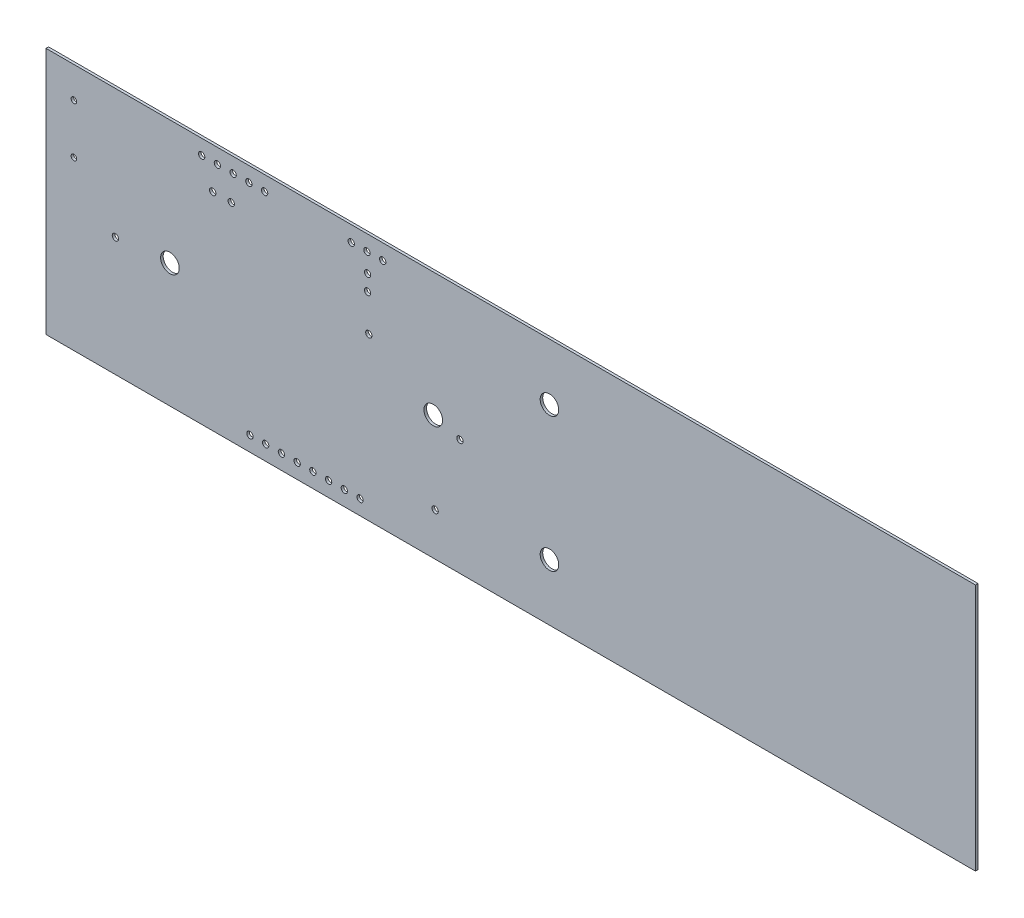
ISO-10303-21;
HEADER;
FILE_DESCRIPTION(('STEP AP214'),'2;1');
FILE_NAME('part.step','',(''),(''),'','','');
FILE_SCHEMA(('AUTOMOTIVE_DESIGN { 1 0 10303 214 1 1 1 1 }'));
ENDSEC;
DATA;
#1=APPLICATION_CONTEXT('core data for automotive mechanical design processes');
#2=APPLICATION_PROTOCOL_DEFINITION('international standard','automotive_design',2000,#1);
#3=PRODUCT_CONTEXT('',#1,'mechanical');
#4=PRODUCT('Part','Part','',(#3));
#5=PRODUCT_RELATED_PRODUCT_CATEGORY('part','',(#4));
#6=PRODUCT_DEFINITION_FORMATION('','',#4);
#7=PRODUCT_DEFINITION_CONTEXT('part definition',#1,'design');
#8=PRODUCT_DEFINITION('design','',#6,#7);
#9=PRODUCT_DEFINITION_SHAPE('','',#8);
#10=(LENGTH_UNIT() NAMED_UNIT(*) SI_UNIT(.MILLI.,.METRE.));
#11=(NAMED_UNIT(*) PLANE_ANGLE_UNIT() SI_UNIT($,.RADIAN.));
#12=(NAMED_UNIT(*) SI_UNIT($,.STERADIAN.) SOLID_ANGLE_UNIT());
#13=UNCERTAINTY_MEASURE_WITH_UNIT(LENGTH_MEASURE(1.E-05),#10,'distance_accuracy_value','');
#14=(GEOMETRIC_REPRESENTATION_CONTEXT(3) GLOBAL_UNCERTAINTY_ASSIGNED_CONTEXT((#13)) GLOBAL_UNIT_ASSIGNED_CONTEXT((#10,
#11,#12)) REPRESENTATION_CONTEXT('',''));
#15=CARTESIAN_POINT('',(0.,0.,0.));
#16=DIRECTION('',(0.,0.,1.));
#17=DIRECTION('',(1.,0.,0.));
#18=AXIS2_PLACEMENT_3D('',#15,#16,#17);
#19=CARTESIAN_POINT('',(149.99999972,0.,0.));
#20=DIRECTION('',(0.,0.,-1.));
#21=DIRECTION('',(-1.,0.,0.));
#22=AXIS2_PLACEMENT_3D('',#19,#20,#21);
#23=PLANE('',#22);
#24=CARTESIAN_POINT('',(81.25000006,30.8299993,0.));
#25=DIRECTION('',(0.,0.,-1.));
#26=DIRECTION('',(-1.,0.,0.));
#27=AXIS2_PLACEMENT_3D('',#24,#25,#26);
#28=CIRCLE('',#27,1.49999954);
#29=CARTESIAN_POINT('',(79.75000052,30.8299993,0.));
#30=VERTEX_POINT('',#29);
#31=EDGE_CURVE('E167',#30,#30,#28,.F.);
#32=ORIENTED_EDGE('',*,*,#31,.T.);
#33=EDGE_LOOP('',(#32));
#34=FACE_BOUND('',#33,.T.);
#35=CARTESIAN_POINT('',(54.339998,37.49999866,0.));
#36=DIRECTION('',(0.,0.,-1.));
#37=DIRECTION('',(-1.,0.,0.));
#38=AXIS2_PLACEMENT_3D('',#35,#36,#37);
#39=CIRCLE('',#38,0.50999898);
#40=CARTESIAN_POINT('',(53.82999902,37.49999866,0.));
#41=VERTEX_POINT('',#40);
#42=EDGE_CURVE('E170',#41,#41,#39,.F.);
#43=ORIENTED_EDGE('',*,*,#42,.T.);
#44=EDGE_LOOP('',(#43));
#45=FACE_BOUND('',#44,.T.);
#46=CARTESIAN_POINT('',(62.49999946,20.00000064,0.));
#47=DIRECTION('',(0.,0.,-1.));
#48=DIRECTION('',(-1.,0.,0.));
#49=AXIS2_PLACEMENT_3D('',#46,#47,#48);
#50=CIRCLE('',#49,1.49999954);
#51=CARTESIAN_POINT('',(60.99999992,20.00000064,0.));
#52=VERTEX_POINT('',#51);
#53=EDGE_CURVE('E173',#52,#52,#50,.F.);
#54=ORIENTED_EDGE('',*,*,#53,.T.);
#55=EDGE_LOOP('',(#54));
#56=FACE_BOUND('',#55,.T.);
#57=CARTESIAN_POINT('',(52.09999994,26.10000114,0.));
#58=DIRECTION('',(0.,0.,-1.));
#59=DIRECTION('',(-1.,0.,0.));
#60=AXIS2_PLACEMENT_3D('',#57,#58,#59);
#61=CIRCLE('',#60,0.50999898);
#62=CARTESIAN_POINT('',(51.59000096,26.10000114,0.));
#63=VERTEX_POINT('',#62);
#64=EDGE_CURVE('E176',#63,#63,#61,.F.);
#65=ORIENTED_EDGE('',*,*,#64,.T.);
#66=EDGE_LOOP('',(#65));
#67=FACE_BOUND('',#66,.T.);
#68=CARTESIAN_POINT('',(51.799998,37.49999866,0.));
#69=DIRECTION('',(0.,0.,-1.));
#70=DIRECTION('',(-1.,0.,0.));
#71=AXIS2_PLACEMENT_3D('',#68,#69,#70);
#72=CIRCLE('',#71,0.50999898);
#73=CARTESIAN_POINT('',(51.28999902,37.49999866,0.));
#74=VERTEX_POINT('',#73);
#75=EDGE_CURVE('E179',#74,#74,#72,.F.);
#76=ORIENTED_EDGE('',*,*,#75,.T.);
#77=EDGE_LOOP('',(#76));
#78=FACE_BOUND('',#77,.T.);
#79=CARTESIAN_POINT('',(49.259998,37.49999866,0.));
#80=DIRECTION('',(0.,0.,-1.));
#81=DIRECTION('',(-1.,0.,0.));
#82=AXIS2_PLACEMENT_3D('',#79,#80,#81);
#83=CIRCLE('',#82,0.50999898);
#84=CARTESIAN_POINT('',(48.74999902,37.49999866,0.));
#85=VERTEX_POINT('',#84);
#86=EDGE_CURVE('E182',#85,#85,#83,.F.);
#87=ORIENTED_EDGE('',*,*,#86,.T.);
#88=EDGE_LOOP('',(#87));
#89=FACE_BOUND('',#88,.T.);
#90=CARTESIAN_POINT('',(51.8999978,31.92999964,0.));
#91=DIRECTION('',(0.,0.,-1.));
#92=DIRECTION('',(-1.,0.,0.));
#93=AXIS2_PLACEMENT_3D('',#90,#91,#92);
#94=CIRCLE('',#93,0.50999898);
#95=CARTESIAN_POINT('',(51.38999882,31.92999964,0.));
#96=VERTEX_POINT('',#95);
#97=EDGE_CURVE('E185',#96,#96,#94,.F.);
#98=ORIENTED_EDGE('',*,*,#97,.T.);
#99=EDGE_LOOP('',(#98));
#100=FACE_BOUND('',#99,.T.);
#101=CARTESIAN_POINT('',(51.8999978,34.46999964,0.));
#102=DIRECTION('',(0.,0.,-1.));
#103=DIRECTION('',(-1.,0.,0.));
#104=AXIS2_PLACEMENT_3D('',#101,#102,#103);
#105=CIRCLE('',#104,0.50999898);
#106=CARTESIAN_POINT('',(51.38999882,34.46999964,0.));
#107=VERTEX_POINT('',#106);
#108=EDGE_CURVE('E188',#107,#107,#105,.F.);
#109=ORIENTED_EDGE('',*,*,#108,.T.);
#110=EDGE_LOOP('',(#109));
#111=FACE_BOUND('',#110,.T.);
#112=CARTESIAN_POINT('',(81.25000006,9.16999944,0.));
#113=DIRECTION('',(0.,0.,-1.));
#114=DIRECTION('',(-1.,0.,0.));
#115=AXIS2_PLACEMENT_3D('',#112,#113,#114);
#116=CIRCLE('',#115,1.49999954);
#117=CARTESIAN_POINT('',(79.75000052,9.16999944,0.));
#118=VERTEX_POINT('',#117);
#119=EDGE_CURVE('E191',#118,#118,#116,.F.);
#120=ORIENTED_EDGE('',*,*,#119,.T.);
#121=EDGE_LOOP('',(#120));
#122=FACE_BOUND('',#121,.T.);
#123=CARTESIAN_POINT('',(66.80000102,18.7000007,0.));
#124=DIRECTION('',(0.,0.,-1.));
#125=DIRECTION('',(-1.,0.,0.));
#126=AXIS2_PLACEMENT_3D('',#123,#124,#125);
#127=CIRCLE('',#126,0.50999898);
#128=CARTESIAN_POINT('',(66.29000204,18.7000007,0.));
#129=VERTEX_POINT('',#128);
#130=EDGE_CURVE('E194',#129,#129,#127,.F.);
#131=ORIENTED_EDGE('',*,*,#130,.T.);
#132=EDGE_LOOP('',(#131));
#133=FACE_BOUND('',#132,.T.);
#134=CARTESIAN_POINT('',(62.79999886,6.8999989,0.));
#135=DIRECTION('',(0.,0.,-1.));
#136=DIRECTION('',(-1.,0.,0.));
#137=AXIS2_PLACEMENT_3D('',#134,#135,#136);
#138=CIRCLE('',#137,0.50999898);
#139=CARTESIAN_POINT('',(62.28999988,6.8999989,0.));
#140=VERTEX_POINT('',#139);
#141=EDGE_CURVE('E197',#140,#140,#138,.F.);
#142=ORIENTED_EDGE('',*,*,#141,.T.);
#143=EDGE_LOOP('',(#142));
#144=FACE_BOUND('',#143,.T.);
#145=CARTESIAN_POINT('',(50.69000022,2.40000028,0.));
#146=DIRECTION('',(0.,0.,-1.));
#147=DIRECTION('',(-1.,0.,0.));
#148=AXIS2_PLACEMENT_3D('',#145,#146,#147);
#149=CIRCLE('',#148,0.50999898);
#150=CARTESIAN_POINT('',(50.18000124,2.40000028,0.));
#151=VERTEX_POINT('',#150);
#152=EDGE_CURVE('E200',#151,#151,#149,.F.);
#153=ORIENTED_EDGE('',*,*,#152,.T.);
#154=EDGE_LOOP('',(#153));
#155=FACE_BOUND('',#154,.T.);
#156=CARTESIAN_POINT('',(45.61000022,2.40000028,0.));
#157=DIRECTION('',(0.,0.,-1.));
#158=DIRECTION('',(-1.,0.,0.));
#159=AXIS2_PLACEMENT_3D('',#156,#157,#158);
#160=CIRCLE('',#159,0.50999898);
#161=CARTESIAN_POINT('',(45.10000124,2.40000028,0.));
#162=VERTEX_POINT('',#161);
#163=EDGE_CURVE('E203',#162,#162,#160,.F.);
#164=ORIENTED_EDGE('',*,*,#163,.T.);
#165=EDGE_LOOP('',(#164));
#166=FACE_BOUND('',#165,.T.);
#167=CARTESIAN_POINT('',(43.07000022,2.40000028,0.));
#168=DIRECTION('',(0.,0.,-1.));
#169=DIRECTION('',(-1.,0.,0.));
#170=AXIS2_PLACEMENT_3D('',#167,#168,#169);
#171=CIRCLE('',#170,0.50999898);
#172=CARTESIAN_POINT('',(42.56000124,2.40000028,0.));
#173=VERTEX_POINT('',#172);
#174=EDGE_CURVE('E206',#173,#173,#171,.F.);
#175=ORIENTED_EDGE('',*,*,#174,.T.);
#176=EDGE_LOOP('',(#175));
#177=FACE_BOUND('',#176,.T.);
#178=CARTESIAN_POINT('',(48.15000022,2.40000028,0.));
#179=DIRECTION('',(0.,0.,-1.));
#180=DIRECTION('',(-1.,0.,0.));
#181=AXIS2_PLACEMENT_3D('',#178,#179,#180);
#182=CIRCLE('',#181,0.50999898);
#183=CARTESIAN_POINT('',(47.64000124,2.40000028,0.));
#184=VERTEX_POINT('',#183);
#185=EDGE_CURVE('E209',#184,#184,#182,.F.);
#186=ORIENTED_EDGE('',*,*,#185,.T.);
#187=EDGE_LOOP('',(#186));
#188=FACE_BOUND('',#187,.T.);
#189=CARTESIAN_POINT('',(35.28000056,37.600001,0.));
#190=DIRECTION('',(0.,0.,-1.));
#191=DIRECTION('',(-1.,0.,0.));
#192=AXIS2_PLACEMENT_3D('',#189,#190,#191);
#193=CIRCLE('',#192,0.50999898);
#194=CARTESIAN_POINT('',(34.77000158,37.600001,0.));
#195=VERTEX_POINT('',#194);
#196=EDGE_CURVE('E212',#195,#195,#193,.F.);
#197=ORIENTED_EDGE('',*,*,#196,.T.);
#198=EDGE_LOOP('',(#197));
#199=FACE_BOUND('',#198,.T.);
#200=CARTESIAN_POINT('',(32.74000056,37.600001,0.));
#201=DIRECTION('',(0.,0.,-1.));
#202=DIRECTION('',(-1.,0.,0.));
#203=AXIS2_PLACEMENT_3D('',#200,#201,#202);
#204=CIRCLE('',#203,0.50999898);
#205=CARTESIAN_POINT('',(32.23000158,37.600001,0.));
#206=VERTEX_POINT('',#205);
#207=EDGE_CURVE('E215',#206,#206,#204,.F.);
#208=ORIENTED_EDGE('',*,*,#207,.T.);
#209=EDGE_LOOP('',(#208));
#210=FACE_BOUND('',#209,.T.);
#211=CARTESIAN_POINT('',(30.20000056,37.600001,0.));
#212=DIRECTION('',(0.,0.,-1.));
#213=DIRECTION('',(-1.,0.,0.));
#214=AXIS2_PLACEMENT_3D('',#211,#212,#213);
#215=CIRCLE('',#214,0.50999898);
#216=CARTESIAN_POINT('',(29.69000158,37.600001,0.));
#217=VERTEX_POINT('',#216);
#218=EDGE_CURVE('E218',#217,#217,#215,.F.);
#219=ORIENTED_EDGE('',*,*,#218,.T.);
#220=EDGE_LOOP('',(#219));
#221=FACE_BOUND('',#220,.T.);
#222=CARTESIAN_POINT('',(29.90000116,33.39999924,0.));
#223=DIRECTION('',(0.,0.,-1.));
#224=DIRECTION('',(-1.,0.,0.));
#225=AXIS2_PLACEMENT_3D('',#222,#223,#224);
#226=CIRCLE('',#225,0.50999898);
#227=CARTESIAN_POINT('',(29.39000218,33.39999924,0.));
#228=VERTEX_POINT('',#227);
#229=EDGE_CURVE('E221',#228,#228,#226,.F.);
#230=ORIENTED_EDGE('',*,*,#229,.T.);
#231=EDGE_LOOP('',(#230));
#232=FACE_BOUND('',#231,.T.);
#233=CARTESIAN_POINT('',(27.66000056,37.600001,0.));
#234=DIRECTION('',(0.,0.,-1.));
#235=DIRECTION('',(-1.,0.,0.));
#236=AXIS2_PLACEMENT_3D('',#233,#234,#235);
#237=CIRCLE('',#236,0.50999898);
#238=CARTESIAN_POINT('',(27.15000158,37.600001,0.));
#239=VERTEX_POINT('',#238);
#240=EDGE_CURVE('E224',#239,#239,#237,.F.);
#241=ORIENTED_EDGE('',*,*,#240,.T.);
#242=EDGE_LOOP('',(#241));
#243=FACE_BOUND('',#242,.T.);
#244=CARTESIAN_POINT('',(25.12000056,37.600001,0.));
#245=DIRECTION('',(0.,0.,-1.));
#246=DIRECTION('',(-1.,0.,0.));
#247=AXIS2_PLACEMENT_3D('',#244,#245,#246);
#248=CIRCLE('',#247,0.50999898);
#249=CARTESIAN_POINT('',(24.61000158,37.600001,0.));
#250=VERTEX_POINT('',#249);
#251=EDGE_CURVE('E227',#250,#250,#248,.F.);
#252=ORIENTED_EDGE('',*,*,#251,.T.);
#253=EDGE_LOOP('',(#252));
#254=FACE_BOUND('',#253,.T.);
#255=CARTESIAN_POINT('',(26.89999954,33.39999924,0.));
#256=DIRECTION('',(0.,0.,-1.));
#257=DIRECTION('',(-1.,0.,0.));
#258=AXIS2_PLACEMENT_3D('',#255,#256,#257);
#259=CIRCLE('',#258,0.50999898);
#260=CARTESIAN_POINT('',(26.39000056,33.39999924,0.));
#261=VERTEX_POINT('',#260);
#262=EDGE_CURVE('E230',#261,#261,#259,.F.);
#263=ORIENTED_EDGE('',*,*,#262,.T.);
#264=EDGE_LOOP('',(#263));
#265=FACE_BOUND('',#264,.T.);
#266=CARTESIAN_POINT('',(4.5000037,35.00000112,0.));
#267=DIRECTION('',(0.,0.,-1.));
#268=DIRECTION('',(-1.,0.,0.));
#269=AXIS2_PLACEMENT_3D('',#266,#267,#268);
#270=CIRCLE('',#269,0.4499991);
#271=CARTESIAN_POINT('',(4.0500046,35.00000112,0.));
#272=VERTEX_POINT('',#271);
#273=EDGE_CURVE('E233',#272,#272,#270,.F.);
#274=ORIENTED_EDGE('',*,*,#273,.T.);
#275=EDGE_LOOP('',(#274));
#276=FACE_BOUND('',#275,.T.);
#277=CARTESIAN_POINT('',(35.45000022,2.40000028,0.));
#278=DIRECTION('',(0.,0.,-1.));
#279=DIRECTION('',(-1.,0.,0.));
#280=AXIS2_PLACEMENT_3D('',#277,#278,#279);
#281=CIRCLE('',#280,0.50999898);
#282=CARTESIAN_POINT('',(34.94000124,2.40000028,0.));
#283=VERTEX_POINT('',#282);
#284=EDGE_CURVE('E236',#283,#283,#281,.F.);
#285=ORIENTED_EDGE('',*,*,#284,.T.);
#286=EDGE_LOOP('',(#285));
#287=FACE_BOUND('',#286,.T.);
#288=CARTESIAN_POINT('',(32.91000022,2.40000028,0.));
#289=DIRECTION('',(0.,0.,-1.));
#290=DIRECTION('',(-1.,0.,0.));
#291=AXIS2_PLACEMENT_3D('',#288,#289,#290);
#292=CIRCLE('',#291,0.50999898);
#293=CARTESIAN_POINT('',(32.40000124,2.40000028,0.));
#294=VERTEX_POINT('',#293);
#295=EDGE_CURVE('E239',#294,#294,#292,.F.);
#296=ORIENTED_EDGE('',*,*,#295,.T.);
#297=EDGE_LOOP('',(#296));
#298=FACE_BOUND('',#297,.T.);
#299=CARTESIAN_POINT('',(40.53000022,2.40000028,0.));
#300=DIRECTION('',(0.,0.,-1.));
#301=DIRECTION('',(-1.,0.,0.));
#302=AXIS2_PLACEMENT_3D('',#299,#300,#301);
#303=CIRCLE('',#302,0.50999898);
#304=CARTESIAN_POINT('',(40.02000124,2.40000028,0.));
#305=VERTEX_POINT('',#304);
#306=EDGE_CURVE('E242',#305,#305,#303,.F.);
#307=ORIENTED_EDGE('',*,*,#306,.T.);
#308=EDGE_LOOP('',(#307));
#309=FACE_BOUND('',#308,.T.);
#310=CARTESIAN_POINT('',(37.99000022,2.40000028,0.));
#311=DIRECTION('',(0.,0.,-1.));
#312=DIRECTION('',(-1.,0.,0.));
#313=AXIS2_PLACEMENT_3D('',#310,#311,#312);
#314=CIRCLE('',#313,0.50999898);
#315=CARTESIAN_POINT('',(37.48000124,2.40000028,0.));
#316=VERTEX_POINT('',#315);
#317=EDGE_CURVE('E245',#316,#316,#314,.F.);
#318=ORIENTED_EDGE('',*,*,#317,.T.);
#319=EDGE_LOOP('',(#318));
#320=FACE_BOUND('',#319,.T.);
#321=CARTESIAN_POINT('',(20.00000064,20.00000064,0.));
#322=DIRECTION('',(0.,0.,-1.));
#323=DIRECTION('',(-1.,0.,0.));
#324=AXIS2_PLACEMENT_3D('',#321,#322,#323);
#325=CIRCLE('',#324,1.49999954);
#326=CARTESIAN_POINT('',(18.5000011,20.00000064,0.));
#327=VERTEX_POINT('',#326);
#328=EDGE_CURVE('E248',#327,#327,#325,.F.);
#329=ORIENTED_EDGE('',*,*,#328,.T.);
#330=EDGE_LOOP('',(#329));
#331=FACE_BOUND('',#330,.T.);
#332=CARTESIAN_POINT('',(4.5000037,26.99999934,0.));
#333=DIRECTION('',(0.,0.,-1.));
#334=DIRECTION('',(-1.,0.,0.));
#335=AXIS2_PLACEMENT_3D('',#332,#333,#334);
#336=CIRCLE('',#335,0.4499991);
#337=CARTESIAN_POINT('',(4.0500046,26.99999934,0.));
#338=VERTEX_POINT('',#337);
#339=EDGE_CURVE('E250',#338,#338,#336,.F.);
#340=ORIENTED_EDGE('',*,*,#339,.T.);
#341=EDGE_LOOP('',(#340));
#342=FACE_BOUND('',#341,.T.);
#343=CARTESIAN_POINT('',(11.20000046,19.1999997,0.));
#344=DIRECTION('',(0.,0.,-1.));
#345=DIRECTION('',(-1.,0.,0.));
#346=AXIS2_PLACEMENT_3D('',#343,#344,#345);
#347=CIRCLE('',#346,0.50999898);
#348=CARTESIAN_POINT('',(10.69000148,19.1999997,0.));
#349=VERTEX_POINT('',#348);
#350=EDGE_CURVE('E20',#349,#349,#347,.F.);
#351=ORIENTED_EDGE('',*,*,#350,.T.);
#352=EDGE_LOOP('',(#351));
#353=FACE_BOUND('',#352,.T.);
#354=DIRECTION('',(1.,0.,0.));
#355=VECTOR('',#354,1.);
#356=CARTESIAN_POINT('',(149.99999972,39.99999874,0.));
#357=LINE('',#356,#355);
#358=CARTESIAN_POINT('',(0.,39.99999874,0.));
#359=VERTEX_POINT('',#358);
#360=CARTESIAN_POINT('',(149.99999972,39.99999874,0.));
#361=VERTEX_POINT('',#360);
#362=EDGE_CURVE('E264',#359,#361,#357,.T.);
#363=ORIENTED_EDGE('',*,*,#362,.T.);
#364=DIRECTION('',(0.,1.,0.));
#365=VECTOR('',#364,1.);
#366=CARTESIAN_POINT('',(149.99999972,0.,0.));
#367=LINE('',#366,#365);
#368=CARTESIAN_POINT('',(149.99999972,0.,0.));
#369=VERTEX_POINT('',#368);
#370=EDGE_CURVE('E60',#361,#369,#367,.F.);
#371=ORIENTED_EDGE('',*,*,#370,.T.);
#372=DIRECTION('',(1.,0.,0.));
#373=VECTOR('',#372,1.);
#374=CARTESIAN_POINT('',(0.,0.,0.));
#375=LINE('',#374,#373);
#376=CARTESIAN_POINT('',(0.,0.,0.));
#377=VERTEX_POINT('',#376);
#378=EDGE_CURVE('E59',#369,#377,#375,.F.);
#379=ORIENTED_EDGE('',*,*,#378,.T.);
#380=DIRECTION('',(0.,1.,0.));
#381=VECTOR('',#380,1.);
#382=CARTESIAN_POINT('',(0.,39.99999874,0.));
#383=LINE('',#382,#381);
#384=EDGE_CURVE('E56',#377,#359,#383,.T.);
#385=ORIENTED_EDGE('',*,*,#384,.T.);
#386=EDGE_LOOP('',(#363,#371,#379,#385));
#387=FACE_BOUND('',#386,.T.);
#388=ADVANCED_FACE('F17',(#34,#45,#56,#67,#78,#89,#100,#111,#122,#133,#144,#155,#166,#177,#188,
#199,#210,#221,#232,#243,#254,#265,#276,#287,#298,#309,#320,#331,#342,#353,#387),#23,.T.);
#389=CARTESIAN_POINT('',(0.,0.,0.));
#390=DIRECTION('',(0.,1.,0.));
#391=DIRECTION('',(0.,0.,1.));
#392=AXIS2_PLACEMENT_3D('',#389,#390,#391);
#393=PLANE('',#392);
#394=DIRECTION('',(0.,0.,1.));
#395=VECTOR('',#394,1.);
#396=CARTESIAN_POINT('',(149.99999972,0.,0.));
#397=LINE('',#396,#395);
#398=CARTESIAN_POINT('',(149.99999972,0.,0.41148));
#399=VERTEX_POINT('',#398);
#400=EDGE_CURVE('E258',#369,#399,#397,.T.);
#401=ORIENTED_EDGE('',*,*,#400,.T.);
#402=DIRECTION('',(-1.,0.,0.));
#403=VECTOR('',#402,1.);
#404=CARTESIAN_POINT('',(149.99999972,0.,0.41148));
#405=LINE('',#404,#403);
#406=CARTESIAN_POINT('',(0.,0.,0.41148));
#407=VERTEX_POINT('',#406);
#408=EDGE_CURVE('E76',#399,#407,#405,.T.);
#409=ORIENTED_EDGE('',*,*,#408,.T.);
#410=DIRECTION('',(0.,0.,-1.));
#411=VECTOR('',#410,1.);
#412=CARTESIAN_POINT('',(0.,0.,0.));
#413=LINE('',#412,#411);
#414=EDGE_CURVE('E65',#407,#377,#413,.T.);
#415=ORIENTED_EDGE('',*,*,#414,.T.);
#416=ORIENTED_EDGE('',*,*,#378,.F.);
#417=EDGE_LOOP('',(#401,#409,#415,#416));
#418=FACE_BOUND('',#417,.T.);
#419=ADVANCED_FACE('F75',(#418),#393,.F.);
#420=CARTESIAN_POINT('',(0.,39.99999874,0.));
#421=DIRECTION('',(1.,0.,0.));
#422=DIRECTION('',(0.,0.,-1.));
#423=AXIS2_PLACEMENT_3D('',#420,#421,#422);
#424=PLANE('',#423);
#425=ORIENTED_EDGE('',*,*,#414,.F.);
#426=DIRECTION('',(0.,1.,0.));
#427=VECTOR('',#426,1.);
#428=CARTESIAN_POINT('',(0.,0.,0.41148));
#429=LINE('',#428,#427);
#430=CARTESIAN_POINT('',(0.,39.99999874,0.41148));
#431=VERTEX_POINT('',#430);
#432=EDGE_CURVE('E272',#407,#431,#429,.T.);
#433=ORIENTED_EDGE('',*,*,#432,.T.);
#434=DIRECTION('',(0.,0.,-1.));
#435=VECTOR('',#434,1.);
#436=CARTESIAN_POINT('',(0.,39.99999874,0.));
#437=LINE('',#436,#435);
#438=EDGE_CURVE('E72',#431,#359,#437,.T.);
#439=ORIENTED_EDGE('',*,*,#438,.T.);
#440=ORIENTED_EDGE('',*,*,#384,.F.);
#441=EDGE_LOOP('',(#425,#433,#439,#440));
#442=FACE_BOUND('',#441,.T.);
#443=ADVANCED_FACE('F69',(#442),#424,.F.);
#444=CARTESIAN_POINT('',(149.99999972,39.99999874,0.));
#445=DIRECTION('',(0.,-1.,0.));
#446=DIRECTION('',(0.,0.,-1.));
#447=AXIS2_PLACEMENT_3D('',#444,#445,#446);
#448=PLANE('',#447);
#449=ORIENTED_EDGE('',*,*,#438,.F.);
#450=DIRECTION('',(-1.,0.,0.));
#451=VECTOR('',#450,1.);
#452=CARTESIAN_POINT('',(149.99999972,39.99999874,0.41148));
#453=LINE('',#452,#451);
#454=CARTESIAN_POINT('',(149.99999972,39.99999874,0.41148));
#455=VERTEX_POINT('',#454);
#456=EDGE_CURVE('E270',#431,#455,#453,.F.);
#457=ORIENTED_EDGE('',*,*,#456,.T.);
#458=DIRECTION('',(0.,0.,1.));
#459=VECTOR('',#458,1.);
#460=CARTESIAN_POINT('',(149.99999972,39.99999874,0.));
#461=LINE('',#460,#459);
#462=EDGE_CURVE('E35',#455,#361,#461,.F.);
#463=ORIENTED_EDGE('',*,*,#462,.T.);
#464=ORIENTED_EDGE('',*,*,#362,.F.);
#465=EDGE_LOOP('',(#449,#457,#463,#464));
#466=FACE_BOUND('',#465,.T.);
#467=ADVANCED_FACE('F268',(#466),#448,.F.);
#468=CARTESIAN_POINT('',(149.99999972,0.,0.));
#469=DIRECTION('',(-1.,0.,0.));
#470=DIRECTION('',(0.,0.,1.));
#471=AXIS2_PLACEMENT_3D('',#468,#469,#470);
#472=PLANE('',#471);
#473=ORIENTED_EDGE('',*,*,#462,.F.);
#474=DIRECTION('',(0.,1.,0.));
#475=VECTOR('',#474,1.);
#476=CARTESIAN_POINT('',(149.99999972,0.,0.41148));
#477=LINE('',#476,#475);
#478=EDGE_CURVE('E166',#455,#399,#477,.F.);
#479=ORIENTED_EDGE('',*,*,#478,.T.);
#480=ORIENTED_EDGE('',*,*,#400,.F.);
#481=ORIENTED_EDGE('',*,*,#370,.F.);
#482=EDGE_LOOP('',(#473,#479,#480,#481));
#483=FACE_BOUND('',#482,.T.);
#484=ADVANCED_FACE('F266',(#483),#472,.F.);
#485=CARTESIAN_POINT('',(11.20000046,19.1999997,0.));
#486=DIRECTION('',(0.,0.,-1.));
#487=DIRECTION('',(-1.,0.,0.));
#488=AXIS2_PLACEMENT_3D('',#485,#486,#487);
#489=CYLINDRICAL_SURFACE('',#488,0.50999898);
#490=CARTESIAN_POINT('',(11.20000046,19.1999997,0.41148));
#491=DIRECTION('',(0.,0.,-1.));
#492=DIRECTION('',(-1.,0.,0.));
#493=AXIS2_PLACEMENT_3D('',#490,#491,#492);
#494=CIRCLE('',#493,0.50999898);
#495=CARTESIAN_POINT('',(10.69000148,19.1999997,0.41148));
#496=VERTEX_POINT('',#495);
#497=EDGE_CURVE('E163',#496,#496,#494,.F.);
#498=ORIENTED_EDGE('',*,*,#497,.T.);
#499=EDGE_LOOP('',(#498));
#500=FACE_BOUND('',#499,.T.);
#501=ORIENTED_EDGE('',*,*,#350,.F.);
#502=EDGE_LOOP('',(#501));
#503=FACE_BOUND('',#502,.T.);
#504=ADVANCED_FACE('F400',(#500,#503),#489,.F.);
#505=CARTESIAN_POINT('',(4.5000037,26.99999934,0.));
#506=DIRECTION('',(0.,0.,-1.));
#507=DIRECTION('',(-1.,0.,0.));
#508=AXIS2_PLACEMENT_3D('',#505,#506,#507);
#509=CYLINDRICAL_SURFACE('',#508,0.4499991);
#510=CARTESIAN_POINT('',(4.5000037,26.99999934,0.41148));
#511=DIRECTION('',(0.,0.,-1.));
#512=DIRECTION('',(-1.,0.,0.));
#513=AXIS2_PLACEMENT_3D('',#510,#511,#512);
#514=CIRCLE('',#513,0.4499991);
#515=CARTESIAN_POINT('',(4.0500046,26.99999934,0.41148));
#516=VERTEX_POINT('',#515);
#517=EDGE_CURVE('E160',#516,#516,#514,.F.);
#518=ORIENTED_EDGE('',*,*,#517,.T.);
#519=EDGE_LOOP('',(#518));
#520=FACE_BOUND('',#519,.T.);
#521=ORIENTED_EDGE('',*,*,#339,.F.);
#522=EDGE_LOOP('',(#521));
#523=FACE_BOUND('',#522,.T.);
#524=ADVANCED_FACE('F396',(#520,#523),#509,.F.);
#525=CARTESIAN_POINT('',(20.00000064,20.00000064,0.));
#526=DIRECTION('',(0.,0.,-1.));
#527=DIRECTION('',(-1.,0.,0.));
#528=AXIS2_PLACEMENT_3D('',#525,#526,#527);
#529=CYLINDRICAL_SURFACE('',#528,1.49999954);
#530=CARTESIAN_POINT('',(20.00000064,20.00000064,0.41148));
#531=DIRECTION('',(0.,0.,-1.));
#532=DIRECTION('',(-1.,0.,0.));
#533=AXIS2_PLACEMENT_3D('',#530,#531,#532);
#534=CIRCLE('',#533,1.49999954);
#535=CARTESIAN_POINT('',(18.5000011,20.00000064,0.41148));
#536=VERTEX_POINT('',#535);
#537=EDGE_CURVE('E157',#536,#536,#534,.F.);
#538=ORIENTED_EDGE('',*,*,#537,.T.);
#539=EDGE_LOOP('',(#538));
#540=FACE_BOUND('',#539,.T.);
#541=ORIENTED_EDGE('',*,*,#328,.F.);
#542=EDGE_LOOP('',(#541));
#543=FACE_BOUND('',#542,.T.);
#544=ADVANCED_FACE('F392',(#540,#543),#529,.F.);
#545=CARTESIAN_POINT('',(37.99000022,2.40000028,0.));
#546=DIRECTION('',(0.,0.,-1.));
#547=DIRECTION('',(-1.,0.,0.));
#548=AXIS2_PLACEMENT_3D('',#545,#546,#547);
#549=CYLINDRICAL_SURFACE('',#548,0.50999898);
#550=CARTESIAN_POINT('',(37.99000022,2.40000028,0.41148));
#551=DIRECTION('',(0.,0.,-1.));
#552=DIRECTION('',(-1.,0.,0.));
#553=AXIS2_PLACEMENT_3D('',#550,#551,#552);
#554=CIRCLE('',#553,0.50999898);
#555=CARTESIAN_POINT('',(37.48000124,2.40000028,0.41148));
#556=VERTEX_POINT('',#555);
#557=EDGE_CURVE('E154',#556,#556,#554,.F.);
#558=ORIENTED_EDGE('',*,*,#557,.T.);
#559=EDGE_LOOP('',(#558));
#560=FACE_BOUND('',#559,.T.);
#561=ORIENTED_EDGE('',*,*,#317,.F.);
#562=EDGE_LOOP('',(#561));
#563=FACE_BOUND('',#562,.T.);
#564=ADVANCED_FACE('F388',(#560,#563),#549,.F.);
#565=CARTESIAN_POINT('',(40.53000022,2.40000028,0.));
#566=DIRECTION('',(0.,0.,-1.));
#567=DIRECTION('',(-1.,0.,0.));
#568=AXIS2_PLACEMENT_3D('',#565,#566,#567);
#569=CYLINDRICAL_SURFACE('',#568,0.50999898);
#570=CARTESIAN_POINT('',(40.53000022,2.40000028,0.41148));
#571=DIRECTION('',(0.,0.,-1.));
#572=DIRECTION('',(-1.,0.,0.));
#573=AXIS2_PLACEMENT_3D('',#570,#571,#572);
#574=CIRCLE('',#573,0.50999898);
#575=CARTESIAN_POINT('',(40.02000124,2.40000028,0.41148));
#576=VERTEX_POINT('',#575);
#577=EDGE_CURVE('E151',#576,#576,#574,.F.);
#578=ORIENTED_EDGE('',*,*,#577,.T.);
#579=EDGE_LOOP('',(#578));
#580=FACE_BOUND('',#579,.T.);
#581=ORIENTED_EDGE('',*,*,#306,.F.);
#582=EDGE_LOOP('',(#581));
#583=FACE_BOUND('',#582,.T.);
#584=ADVANCED_FACE('F384',(#580,#583),#569,.F.);
#585=CARTESIAN_POINT('',(32.91000022,2.40000028,0.));
#586=DIRECTION('',(0.,0.,-1.));
#587=DIRECTION('',(-1.,0.,0.));
#588=AXIS2_PLACEMENT_3D('',#585,#586,#587);
#589=CYLINDRICAL_SURFACE('',#588,0.50999898);
#590=CARTESIAN_POINT('',(32.91000022,2.40000028,0.41148));
#591=DIRECTION('',(0.,0.,-1.));
#592=DIRECTION('',(-1.,0.,0.));
#593=AXIS2_PLACEMENT_3D('',#590,#591,#592);
#594=CIRCLE('',#593,0.50999898);
#595=CARTESIAN_POINT('',(32.40000124,2.40000028,0.41148));
#596=VERTEX_POINT('',#595);
#597=EDGE_CURVE('E148',#596,#596,#594,.F.);
#598=ORIENTED_EDGE('',*,*,#597,.T.);
#599=EDGE_LOOP('',(#598));
#600=FACE_BOUND('',#599,.T.);
#601=ORIENTED_EDGE('',*,*,#295,.F.);
#602=EDGE_LOOP('',(#601));
#603=FACE_BOUND('',#602,.T.);
#604=ADVANCED_FACE('F380',(#600,#603),#589,.F.);
#605=CARTESIAN_POINT('',(35.45000022,2.40000028,0.));
#606=DIRECTION('',(0.,0.,-1.));
#607=DIRECTION('',(-1.,0.,0.));
#608=AXIS2_PLACEMENT_3D('',#605,#606,#607);
#609=CYLINDRICAL_SURFACE('',#608,0.50999898);
#610=CARTESIAN_POINT('',(35.45000022,2.40000028,0.41148));
#611=DIRECTION('',(0.,0.,-1.));
#612=DIRECTION('',(-1.,0.,0.));
#613=AXIS2_PLACEMENT_3D('',#610,#611,#612);
#614=CIRCLE('',#613,0.50999898);
#615=CARTESIAN_POINT('',(34.94000124,2.40000028,0.41148));
#616=VERTEX_POINT('',#615);
#617=EDGE_CURVE('E145',#616,#616,#614,.F.);
#618=ORIENTED_EDGE('',*,*,#617,.T.);
#619=EDGE_LOOP('',(#618));
#620=FACE_BOUND('',#619,.T.);
#621=ORIENTED_EDGE('',*,*,#284,.F.);
#622=EDGE_LOOP('',(#621));
#623=FACE_BOUND('',#622,.T.);
#624=ADVANCED_FACE('F376',(#620,#623),#609,.F.);
#625=CARTESIAN_POINT('',(4.5000037,35.00000112,0.));
#626=DIRECTION('',(0.,0.,-1.));
#627=DIRECTION('',(-1.,0.,0.));
#628=AXIS2_PLACEMENT_3D('',#625,#626,#627);
#629=CYLINDRICAL_SURFACE('',#628,0.4499991);
#630=CARTESIAN_POINT('',(4.5000037,35.00000112,0.41148));
#631=DIRECTION('',(0.,0.,-1.));
#632=DIRECTION('',(-1.,0.,0.));
#633=AXIS2_PLACEMENT_3D('',#630,#631,#632);
#634=CIRCLE('',#633,0.4499991);
#635=CARTESIAN_POINT('',(4.0500046,35.00000112,0.41148));
#636=VERTEX_POINT('',#635);
#637=EDGE_CURVE('E142',#636,#636,#634,.F.);
#638=ORIENTED_EDGE('',*,*,#637,.T.);
#639=EDGE_LOOP('',(#638));
#640=FACE_BOUND('',#639,.T.);
#641=ORIENTED_EDGE('',*,*,#273,.F.);
#642=EDGE_LOOP('',(#641));
#643=FACE_BOUND('',#642,.T.);
#644=ADVANCED_FACE('F372',(#640,#643),#629,.F.);
#645=CARTESIAN_POINT('',(26.89999954,33.39999924,0.));
#646=DIRECTION('',(0.,0.,-1.));
#647=DIRECTION('',(-1.,0.,0.));
#648=AXIS2_PLACEMENT_3D('',#645,#646,#647);
#649=CYLINDRICAL_SURFACE('',#648,0.50999898);
#650=CARTESIAN_POINT('',(26.89999954,33.39999924,0.41148));
#651=DIRECTION('',(0.,0.,-1.));
#652=DIRECTION('',(-1.,0.,0.));
#653=AXIS2_PLACEMENT_3D('',#650,#651,#652);
#654=CIRCLE('',#653,0.50999898);
#655=CARTESIAN_POINT('',(26.39000056,33.39999924,0.41148));
#656=VERTEX_POINT('',#655);
#657=EDGE_CURVE('E139',#656,#656,#654,.F.);
#658=ORIENTED_EDGE('',*,*,#657,.T.);
#659=EDGE_LOOP('',(#658));
#660=FACE_BOUND('',#659,.T.);
#661=ORIENTED_EDGE('',*,*,#262,.F.);
#662=EDGE_LOOP('',(#661));
#663=FACE_BOUND('',#662,.T.);
#664=ADVANCED_FACE('F368',(#660,#663),#649,.F.);
#665=CARTESIAN_POINT('',(25.12000056,37.600001,0.));
#666=DIRECTION('',(0.,0.,-1.));
#667=DIRECTION('',(-1.,0.,0.));
#668=AXIS2_PLACEMENT_3D('',#665,#666,#667);
#669=CYLINDRICAL_SURFACE('',#668,0.50999898);
#670=CARTESIAN_POINT('',(25.12000056,37.600001,0.41148));
#671=DIRECTION('',(0.,0.,-1.));
#672=DIRECTION('',(-1.,0.,0.));
#673=AXIS2_PLACEMENT_3D('',#670,#671,#672);
#674=CIRCLE('',#673,0.50999898);
#675=CARTESIAN_POINT('',(24.61000158,37.600001,0.41148));
#676=VERTEX_POINT('',#675);
#677=EDGE_CURVE('E136',#676,#676,#674,.F.);
#678=ORIENTED_EDGE('',*,*,#677,.T.);
#679=EDGE_LOOP('',(#678));
#680=FACE_BOUND('',#679,.T.);
#681=ORIENTED_EDGE('',*,*,#251,.F.);
#682=EDGE_LOOP('',(#681));
#683=FACE_BOUND('',#682,.T.);
#684=ADVANCED_FACE('F364',(#680,#683),#669,.F.);
#685=CARTESIAN_POINT('',(27.66000056,37.600001,0.));
#686=DIRECTION('',(0.,0.,-1.));
#687=DIRECTION('',(-1.,0.,0.));
#688=AXIS2_PLACEMENT_3D('',#685,#686,#687);
#689=CYLINDRICAL_SURFACE('',#688,0.50999898);
#690=CARTESIAN_POINT('',(27.66000056,37.600001,0.41148));
#691=DIRECTION('',(0.,0.,-1.));
#692=DIRECTION('',(-1.,0.,0.));
#693=AXIS2_PLACEMENT_3D('',#690,#691,#692);
#694=CIRCLE('',#693,0.50999898);
#695=CARTESIAN_POINT('',(27.15000158,37.600001,0.41148));
#696=VERTEX_POINT('',#695);
#697=EDGE_CURVE('E133',#696,#696,#694,.F.);
#698=ORIENTED_EDGE('',*,*,#697,.T.);
#699=EDGE_LOOP('',(#698));
#700=FACE_BOUND('',#699,.T.);
#701=ORIENTED_EDGE('',*,*,#240,.F.);
#702=EDGE_LOOP('',(#701));
#703=FACE_BOUND('',#702,.T.);
#704=ADVANCED_FACE('F360',(#700,#703),#689,.F.);
#705=CARTESIAN_POINT('',(29.90000116,33.39999924,0.));
#706=DIRECTION('',(0.,0.,-1.));
#707=DIRECTION('',(-1.,0.,0.));
#708=AXIS2_PLACEMENT_3D('',#705,#706,#707);
#709=CYLINDRICAL_SURFACE('',#708,0.50999898);
#710=CARTESIAN_POINT('',(29.90000116,33.39999924,0.41148));
#711=DIRECTION('',(0.,0.,-1.));
#712=DIRECTION('',(-1.,0.,0.));
#713=AXIS2_PLACEMENT_3D('',#710,#711,#712);
#714=CIRCLE('',#713,0.50999898);
#715=CARTESIAN_POINT('',(29.39000218,33.39999924,0.41148));
#716=VERTEX_POINT('',#715);
#717=EDGE_CURVE('E130',#716,#716,#714,.F.);
#718=ORIENTED_EDGE('',*,*,#717,.T.);
#719=EDGE_LOOP('',(#718));
#720=FACE_BOUND('',#719,.T.);
#721=ORIENTED_EDGE('',*,*,#229,.F.);
#722=EDGE_LOOP('',(#721));
#723=FACE_BOUND('',#722,.T.);
#724=ADVANCED_FACE('F356',(#720,#723),#709,.F.);
#725=CARTESIAN_POINT('',(30.20000056,37.600001,0.));
#726=DIRECTION('',(0.,0.,-1.));
#727=DIRECTION('',(-1.,0.,0.));
#728=AXIS2_PLACEMENT_3D('',#725,#726,#727);
#729=CYLINDRICAL_SURFACE('',#728,0.50999898);
#730=CARTESIAN_POINT('',(30.20000056,37.600001,0.41148));
#731=DIRECTION('',(0.,0.,-1.));
#732=DIRECTION('',(-1.,0.,0.));
#733=AXIS2_PLACEMENT_3D('',#730,#731,#732);
#734=CIRCLE('',#733,0.50999898);
#735=CARTESIAN_POINT('',(29.69000158,37.600001,0.41148));
#736=VERTEX_POINT('',#735);
#737=EDGE_CURVE('E127',#736,#736,#734,.F.);
#738=ORIENTED_EDGE('',*,*,#737,.T.);
#739=EDGE_LOOP('',(#738));
#740=FACE_BOUND('',#739,.T.);
#741=ORIENTED_EDGE('',*,*,#218,.F.);
#742=EDGE_LOOP('',(#741));
#743=FACE_BOUND('',#742,.T.);
#744=ADVANCED_FACE('F352',(#740,#743),#729,.F.);
#745=CARTESIAN_POINT('',(32.74000056,37.600001,0.));
#746=DIRECTION('',(0.,0.,-1.));
#747=DIRECTION('',(-1.,0.,0.));
#748=AXIS2_PLACEMENT_3D('',#745,#746,#747);
#749=CYLINDRICAL_SURFACE('',#748,0.50999898);
#750=CARTESIAN_POINT('',(32.74000056,37.600001,0.41148));
#751=DIRECTION('',(0.,0.,-1.));
#752=DIRECTION('',(-1.,0.,0.));
#753=AXIS2_PLACEMENT_3D('',#750,#751,#752);
#754=CIRCLE('',#753,0.50999898);
#755=CARTESIAN_POINT('',(32.23000158,37.600001,0.41148));
#756=VERTEX_POINT('',#755);
#757=EDGE_CURVE('E124',#756,#756,#754,.F.);
#758=ORIENTED_EDGE('',*,*,#757,.T.);
#759=EDGE_LOOP('',(#758));
#760=FACE_BOUND('',#759,.T.);
#761=ORIENTED_EDGE('',*,*,#207,.F.);
#762=EDGE_LOOP('',(#761));
#763=FACE_BOUND('',#762,.T.);
#764=ADVANCED_FACE('F348',(#760,#763),#749,.F.);
#765=CARTESIAN_POINT('',(35.28000056,37.600001,0.));
#766=DIRECTION('',(0.,0.,-1.));
#767=DIRECTION('',(-1.,0.,0.));
#768=AXIS2_PLACEMENT_3D('',#765,#766,#767);
#769=CYLINDRICAL_SURFACE('',#768,0.50999898);
#770=CARTESIAN_POINT('',(35.28000056,37.600001,0.41148));
#771=DIRECTION('',(0.,0.,-1.));
#772=DIRECTION('',(-1.,0.,0.));
#773=AXIS2_PLACEMENT_3D('',#770,#771,#772);
#774=CIRCLE('',#773,0.50999898);
#775=CARTESIAN_POINT('',(34.77000158,37.600001,0.41148));
#776=VERTEX_POINT('',#775);
#777=EDGE_CURVE('E121',#776,#776,#774,.F.);
#778=ORIENTED_EDGE('',*,*,#777,.T.);
#779=EDGE_LOOP('',(#778));
#780=FACE_BOUND('',#779,.T.);
#781=ORIENTED_EDGE('',*,*,#196,.F.);
#782=EDGE_LOOP('',(#781));
#783=FACE_BOUND('',#782,.T.);
#784=ADVANCED_FACE('F344',(#780,#783),#769,.F.);
#785=CARTESIAN_POINT('',(48.15000022,2.40000028,0.));
#786=DIRECTION('',(0.,0.,-1.));
#787=DIRECTION('',(-1.,0.,0.));
#788=AXIS2_PLACEMENT_3D('',#785,#786,#787);
#789=CYLINDRICAL_SURFACE('',#788,0.50999898);
#790=CARTESIAN_POINT('',(48.15000022,2.40000028,0.41148));
#791=DIRECTION('',(0.,0.,-1.));
#792=DIRECTION('',(-1.,0.,0.));
#793=AXIS2_PLACEMENT_3D('',#790,#791,#792);
#794=CIRCLE('',#793,0.50999898);
#795=CARTESIAN_POINT('',(47.64000124,2.40000028,0.41148));
#796=VERTEX_POINT('',#795);
#797=EDGE_CURVE('E118',#796,#796,#794,.F.);
#798=ORIENTED_EDGE('',*,*,#797,.T.);
#799=EDGE_LOOP('',(#798));
#800=FACE_BOUND('',#799,.T.);
#801=ORIENTED_EDGE('',*,*,#185,.F.);
#802=EDGE_LOOP('',(#801));
#803=FACE_BOUND('',#802,.T.);
#804=ADVANCED_FACE('F340',(#800,#803),#789,.F.);
#805=CARTESIAN_POINT('',(43.07000022,2.40000028,0.));
#806=DIRECTION('',(0.,0.,-1.));
#807=DIRECTION('',(-1.,0.,0.));
#808=AXIS2_PLACEMENT_3D('',#805,#806,#807);
#809=CYLINDRICAL_SURFACE('',#808,0.50999898);
#810=CARTESIAN_POINT('',(43.07000022,2.40000028,0.41148));
#811=DIRECTION('',(0.,0.,-1.));
#812=DIRECTION('',(-1.,0.,0.));
#813=AXIS2_PLACEMENT_3D('',#810,#811,#812);
#814=CIRCLE('',#813,0.50999898);
#815=CARTESIAN_POINT('',(42.56000124,2.40000028,0.41148));
#816=VERTEX_POINT('',#815);
#817=EDGE_CURVE('E115',#816,#816,#814,.F.);
#818=ORIENTED_EDGE('',*,*,#817,.T.);
#819=EDGE_LOOP('',(#818));
#820=FACE_BOUND('',#819,.T.);
#821=ORIENTED_EDGE('',*,*,#174,.F.);
#822=EDGE_LOOP('',(#821));
#823=FACE_BOUND('',#822,.T.);
#824=ADVANCED_FACE('F336',(#820,#823),#809,.F.);
#825=CARTESIAN_POINT('',(45.61000022,2.40000028,0.));
#826=DIRECTION('',(0.,0.,-1.));
#827=DIRECTION('',(-1.,0.,0.));
#828=AXIS2_PLACEMENT_3D('',#825,#826,#827);
#829=CYLINDRICAL_SURFACE('',#828,0.50999898);
#830=CARTESIAN_POINT('',(45.61000022,2.40000028,0.41148));
#831=DIRECTION('',(0.,0.,-1.));
#832=DIRECTION('',(-1.,0.,0.));
#833=AXIS2_PLACEMENT_3D('',#830,#831,#832);
#834=CIRCLE('',#833,0.50999898);
#835=CARTESIAN_POINT('',(45.10000124,2.40000028,0.41148));
#836=VERTEX_POINT('',#835);
#837=EDGE_CURVE('E112',#836,#836,#834,.F.);
#838=ORIENTED_EDGE('',*,*,#837,.T.);
#839=EDGE_LOOP('',(#838));
#840=FACE_BOUND('',#839,.T.);
#841=ORIENTED_EDGE('',*,*,#163,.F.);
#842=EDGE_LOOP('',(#841));
#843=FACE_BOUND('',#842,.T.);
#844=ADVANCED_FACE('F332',(#840,#843),#829,.F.);
#845=CARTESIAN_POINT('',(50.69000022,2.40000028,0.));
#846=DIRECTION('',(0.,0.,-1.));
#847=DIRECTION('',(-1.,0.,0.));
#848=AXIS2_PLACEMENT_3D('',#845,#846,#847);
#849=CYLINDRICAL_SURFACE('',#848,0.50999898);
#850=CARTESIAN_POINT('',(50.69000022,2.40000028,0.41148));
#851=DIRECTION('',(0.,0.,-1.));
#852=DIRECTION('',(-1.,0.,0.));
#853=AXIS2_PLACEMENT_3D('',#850,#851,#852);
#854=CIRCLE('',#853,0.50999898);
#855=CARTESIAN_POINT('',(50.18000124,2.40000028,0.41148));
#856=VERTEX_POINT('',#855);
#857=EDGE_CURVE('E109',#856,#856,#854,.F.);
#858=ORIENTED_EDGE('',*,*,#857,.T.);
#859=EDGE_LOOP('',(#858));
#860=FACE_BOUND('',#859,.T.);
#861=ORIENTED_EDGE('',*,*,#152,.F.);
#862=EDGE_LOOP('',(#861));
#863=FACE_BOUND('',#862,.T.);
#864=ADVANCED_FACE('F328',(#860,#863),#849,.F.);
#865=CARTESIAN_POINT('',(62.79999886,6.8999989,0.));
#866=DIRECTION('',(0.,0.,-1.));
#867=DIRECTION('',(-1.,0.,0.));
#868=AXIS2_PLACEMENT_3D('',#865,#866,#867);
#869=CYLINDRICAL_SURFACE('',#868,0.50999898);
#870=CARTESIAN_POINT('',(62.79999886,6.8999989,0.41148));
#871=DIRECTION('',(0.,0.,-1.));
#872=DIRECTION('',(-1.,0.,0.));
#873=AXIS2_PLACEMENT_3D('',#870,#871,#872);
#874=CIRCLE('',#873,0.50999898);
#875=CARTESIAN_POINT('',(62.28999988,6.8999989,0.41148));
#876=VERTEX_POINT('',#875);
#877=EDGE_CURVE('E106',#876,#876,#874,.F.);
#878=ORIENTED_EDGE('',*,*,#877,.T.);
#879=EDGE_LOOP('',(#878));
#880=FACE_BOUND('',#879,.T.);
#881=ORIENTED_EDGE('',*,*,#141,.F.);
#882=EDGE_LOOP('',(#881));
#883=FACE_BOUND('',#882,.T.);
#884=ADVANCED_FACE('F324',(#880,#883),#869,.F.);
#885=CARTESIAN_POINT('',(66.80000102,18.7000007,0.));
#886=DIRECTION('',(0.,0.,-1.));
#887=DIRECTION('',(-1.,0.,0.));
#888=AXIS2_PLACEMENT_3D('',#885,#886,#887);
#889=CYLINDRICAL_SURFACE('',#888,0.50999898);
#890=CARTESIAN_POINT('',(66.80000102,18.7000007,0.41148));
#891=DIRECTION('',(0.,0.,-1.));
#892=DIRECTION('',(-1.,0.,0.));
#893=AXIS2_PLACEMENT_3D('',#890,#891,#892);
#894=CIRCLE('',#893,0.50999898);
#895=CARTESIAN_POINT('',(66.29000204,18.7000007,0.41148));
#896=VERTEX_POINT('',#895);
#897=EDGE_CURVE('E103',#896,#896,#894,.F.);
#898=ORIENTED_EDGE('',*,*,#897,.T.);
#899=EDGE_LOOP('',(#898));
#900=FACE_BOUND('',#899,.T.);
#901=ORIENTED_EDGE('',*,*,#130,.F.);
#902=EDGE_LOOP('',(#901));
#903=FACE_BOUND('',#902,.T.);
#904=ADVANCED_FACE('F320',(#900,#903),#889,.F.);
#905=CARTESIAN_POINT('',(81.25000006,9.16999944,0.));
#906=DIRECTION('',(0.,0.,-1.));
#907=DIRECTION('',(-1.,0.,0.));
#908=AXIS2_PLACEMENT_3D('',#905,#906,#907);
#909=CYLINDRICAL_SURFACE('',#908,1.49999954);
#910=CARTESIAN_POINT('',(81.25000006,9.16999944,0.41148));
#911=DIRECTION('',(0.,0.,-1.));
#912=DIRECTION('',(-1.,0.,0.));
#913=AXIS2_PLACEMENT_3D('',#910,#911,#912);
#914=CIRCLE('',#913,1.49999954);
#915=CARTESIAN_POINT('',(79.75000052,9.16999944,0.41148));
#916=VERTEX_POINT('',#915);
#917=EDGE_CURVE('E100',#916,#916,#914,.F.);
#918=ORIENTED_EDGE('',*,*,#917,.T.);
#919=EDGE_LOOP('',(#918));
#920=FACE_BOUND('',#919,.T.);
#921=ORIENTED_EDGE('',*,*,#119,.F.);
#922=EDGE_LOOP('',(#921));
#923=FACE_BOUND('',#922,.T.);
#924=ADVANCED_FACE('F316',(#920,#923),#909,.F.);
#925=CARTESIAN_POINT('',(51.8999978,34.46999964,0.));
#926=DIRECTION('',(0.,0.,-1.));
#927=DIRECTION('',(-1.,0.,0.));
#928=AXIS2_PLACEMENT_3D('',#925,#926,#927);
#929=CYLINDRICAL_SURFACE('',#928,0.50999898);
#930=CARTESIAN_POINT('',(51.8999978,34.46999964,0.41148));
#931=DIRECTION('',(0.,0.,-1.));
#932=DIRECTION('',(-1.,0.,0.));
#933=AXIS2_PLACEMENT_3D('',#930,#931,#932);
#934=CIRCLE('',#933,0.50999898);
#935=CARTESIAN_POINT('',(51.38999882,34.46999964,0.41148));
#936=VERTEX_POINT('',#935);
#937=EDGE_CURVE('E97',#936,#936,#934,.F.);
#938=ORIENTED_EDGE('',*,*,#937,.T.);
#939=EDGE_LOOP('',(#938));
#940=FACE_BOUND('',#939,.T.);
#941=ORIENTED_EDGE('',*,*,#108,.F.);
#942=EDGE_LOOP('',(#941));
#943=FACE_BOUND('',#942,.T.);
#944=ADVANCED_FACE('F312',(#940,#943),#929,.F.);
#945=CARTESIAN_POINT('',(51.8999978,31.92999964,0.));
#946=DIRECTION('',(0.,0.,-1.));
#947=DIRECTION('',(-1.,0.,0.));
#948=AXIS2_PLACEMENT_3D('',#945,#946,#947);
#949=CYLINDRICAL_SURFACE('',#948,0.50999898);
#950=CARTESIAN_POINT('',(51.8999978,31.92999964,0.41148));
#951=DIRECTION('',(0.,0.,-1.));
#952=DIRECTION('',(-1.,0.,0.));
#953=AXIS2_PLACEMENT_3D('',#950,#951,#952);
#954=CIRCLE('',#953,0.50999898);
#955=CARTESIAN_POINT('',(51.38999882,31.92999964,0.41148));
#956=VERTEX_POINT('',#955);
#957=EDGE_CURVE('E94',#956,#956,#954,.F.);
#958=ORIENTED_EDGE('',*,*,#957,.T.);
#959=EDGE_LOOP('',(#958));
#960=FACE_BOUND('',#959,.T.);
#961=ORIENTED_EDGE('',*,*,#97,.F.);
#962=EDGE_LOOP('',(#961));
#963=FACE_BOUND('',#962,.T.);
#964=ADVANCED_FACE('F308',(#960,#963),#949,.F.);
#965=CARTESIAN_POINT('',(49.259998,37.49999866,0.));
#966=DIRECTION('',(0.,0.,-1.));
#967=DIRECTION('',(-1.,0.,0.));
#968=AXIS2_PLACEMENT_3D('',#965,#966,#967);
#969=CYLINDRICAL_SURFACE('',#968,0.50999898);
#970=CARTESIAN_POINT('',(49.259998,37.49999866,0.41148));
#971=DIRECTION('',(0.,0.,-1.));
#972=DIRECTION('',(-1.,0.,0.));
#973=AXIS2_PLACEMENT_3D('',#970,#971,#972);
#974=CIRCLE('',#973,0.50999898);
#975=CARTESIAN_POINT('',(48.74999902,37.49999866,0.41148));
#976=VERTEX_POINT('',#975);
#977=EDGE_CURVE('E91',#976,#976,#974,.F.);
#978=ORIENTED_EDGE('',*,*,#977,.T.);
#979=EDGE_LOOP('',(#978));
#980=FACE_BOUND('',#979,.T.);
#981=ORIENTED_EDGE('',*,*,#86,.F.);
#982=EDGE_LOOP('',(#981));
#983=FACE_BOUND('',#982,.T.);
#984=ADVANCED_FACE('F304',(#980,#983),#969,.F.);
#985=CARTESIAN_POINT('',(51.799998,37.49999866,0.));
#986=DIRECTION('',(0.,0.,-1.));
#987=DIRECTION('',(-1.,0.,0.));
#988=AXIS2_PLACEMENT_3D('',#985,#986,#987);
#989=CYLINDRICAL_SURFACE('',#988,0.50999898);
#990=CARTESIAN_POINT('',(51.799998,37.49999866,0.41148));
#991=DIRECTION('',(0.,0.,-1.));
#992=DIRECTION('',(-1.,0.,0.));
#993=AXIS2_PLACEMENT_3D('',#990,#991,#992);
#994=CIRCLE('',#993,0.50999898);
#995=CARTESIAN_POINT('',(51.28999902,37.49999866,0.41148));
#996=VERTEX_POINT('',#995);
#997=EDGE_CURVE('E88',#996,#996,#994,.F.);
#998=ORIENTED_EDGE('',*,*,#997,.T.);
#999=EDGE_LOOP('',(#998));
#1000=FACE_BOUND('',#999,.T.);
#1001=ORIENTED_EDGE('',*,*,#75,.F.);
#1002=EDGE_LOOP('',(#1001));
#1003=FACE_BOUND('',#1002,.T.);
#1004=ADVANCED_FACE('F300',(#1000,#1003),#989,.F.);
#1005=CARTESIAN_POINT('',(52.09999994,26.10000114,0.));
#1006=DIRECTION('',(0.,0.,-1.));
#1007=DIRECTION('',(-1.,0.,0.));
#1008=AXIS2_PLACEMENT_3D('',#1005,#1006,#1007);
#1009=CYLINDRICAL_SURFACE('',#1008,0.50999898);
#1010=CARTESIAN_POINT('',(52.09999994,26.10000114,0.41148));
#1011=DIRECTION('',(0.,0.,-1.));
#1012=DIRECTION('',(-1.,0.,0.));
#1013=AXIS2_PLACEMENT_3D('',#1010,#1011,#1012);
#1014=CIRCLE('',#1013,0.50999898);
#1015=CARTESIAN_POINT('',(51.59000096,26.10000114,0.41148));
#1016=VERTEX_POINT('',#1015);
#1017=EDGE_CURVE('E85',#1016,#1016,#1014,.F.);
#1018=ORIENTED_EDGE('',*,*,#1017,.T.);
#1019=EDGE_LOOP('',(#1018));
#1020=FACE_BOUND('',#1019,.T.);
#1021=ORIENTED_EDGE('',*,*,#64,.F.);
#1022=EDGE_LOOP('',(#1021));
#1023=FACE_BOUND('',#1022,.T.);
#1024=ADVANCED_FACE('F296',(#1020,#1023),#1009,.F.);
#1025=CARTESIAN_POINT('',(62.49999946,20.00000064,0.));
#1026=DIRECTION('',(0.,0.,-1.));
#1027=DIRECTION('',(-1.,0.,0.));
#1028=AXIS2_PLACEMENT_3D('',#1025,#1026,#1027);
#1029=CYLINDRICAL_SURFACE('',#1028,1.49999954);
#1030=CARTESIAN_POINT('',(62.49999946,20.00000064,0.41148));
#1031=DIRECTION('',(0.,0.,-1.));
#1032=DIRECTION('',(-1.,0.,0.));
#1033=AXIS2_PLACEMENT_3D('',#1030,#1031,#1032);
#1034=CIRCLE('',#1033,1.49999954);
#1035=CARTESIAN_POINT('',(60.99999992,20.00000064,0.41148));
#1036=VERTEX_POINT('',#1035);
#1037=EDGE_CURVE('E82',#1036,#1036,#1034,.F.);
#1038=ORIENTED_EDGE('',*,*,#1037,.T.);
#1039=EDGE_LOOP('',(#1038));
#1040=FACE_BOUND('',#1039,.T.);
#1041=ORIENTED_EDGE('',*,*,#53,.F.);
#1042=EDGE_LOOP('',(#1041));
#1043=FACE_BOUND('',#1042,.T.);
#1044=ADVANCED_FACE('F292',(#1040,#1043),#1029,.F.);
#1045=CARTESIAN_POINT('',(54.339998,37.49999866,0.));
#1046=DIRECTION('',(0.,0.,-1.));
#1047=DIRECTION('',(-1.,0.,0.));
#1048=AXIS2_PLACEMENT_3D('',#1045,#1046,#1047);
#1049=CYLINDRICAL_SURFACE('',#1048,0.50999898);
#1050=CARTESIAN_POINT('',(54.339998,37.49999866,0.41148));
#1051=DIRECTION('',(0.,0.,-1.));
#1052=DIRECTION('',(-1.,0.,0.));
#1053=AXIS2_PLACEMENT_3D('',#1050,#1051,#1052);
#1054=CIRCLE('',#1053,0.50999898);
#1055=CARTESIAN_POINT('',(53.82999902,37.49999866,0.41148));
#1056=VERTEX_POINT('',#1055);
#1057=EDGE_CURVE('E26',#1056,#1056,#1054,.F.);
#1058=ORIENTED_EDGE('',*,*,#1057,.T.);
#1059=EDGE_LOOP('',(#1058));
#1060=FACE_BOUND('',#1059,.T.);
#1061=ORIENTED_EDGE('',*,*,#42,.F.);
#1062=EDGE_LOOP('',(#1061));
#1063=FACE_BOUND('',#1062,.T.);
#1064=ADVANCED_FACE('F284',(#1060,#1063),#1049,.F.);
#1065=CARTESIAN_POINT('',(81.25000006,30.8299993,0.));
#1066=DIRECTION('',(0.,0.,-1.));
#1067=DIRECTION('',(-1.,0.,0.));
#1068=AXIS2_PLACEMENT_3D('',#1065,#1066,#1067);
#1069=CYLINDRICAL_SURFACE('',#1068,1.49999954);
#1070=CARTESIAN_POINT('',(81.25000006,30.8299993,0.41148));
#1071=DIRECTION('',(0.,0.,-1.));
#1072=DIRECTION('',(-1.,0.,0.));
#1073=AXIS2_PLACEMENT_3D('',#1070,#1071,#1072);
#1074=CIRCLE('',#1073,1.49999954);
#1075=CARTESIAN_POINT('',(79.75000052,30.8299993,0.41148));
#1076=VERTEX_POINT('',#1075);
#1077=EDGE_CURVE('E11',#1076,#1076,#1074,.F.);
#1078=ORIENTED_EDGE('',*,*,#1077,.T.);
#1079=EDGE_LOOP('',(#1078));
#1080=FACE_BOUND('',#1079,.T.);
#1081=ORIENTED_EDGE('',*,*,#31,.F.);
#1082=EDGE_LOOP('',(#1081));
#1083=FACE_BOUND('',#1082,.T.);
#1084=ADVANCED_FACE('F277',(#1080,#1083),#1069,.F.);
#1085=CARTESIAN_POINT('',(149.99999972,0.,0.41148));
#1086=DIRECTION('',(0.,0.,-1.));
#1087=DIRECTION('',(-1.,0.,0.));
#1088=AXIS2_PLACEMENT_3D('',#1085,#1086,#1087);
#1089=PLANE('',#1088);
#1090=ORIENTED_EDGE('',*,*,#1077,.F.);
#1091=EDGE_LOOP('',(#1090));
#1092=FACE_BOUND('',#1091,.T.);
#1093=ORIENTED_EDGE('',*,*,#1057,.F.);
#1094=EDGE_LOOP('',(#1093));
#1095=FACE_BOUND('',#1094,.T.);
#1096=ORIENTED_EDGE('',*,*,#1037,.F.);
#1097=EDGE_LOOP('',(#1096));
#1098=FACE_BOUND('',#1097,.T.);
#1099=ORIENTED_EDGE('',*,*,#1017,.F.);
#1100=EDGE_LOOP('',(#1099));
#1101=FACE_BOUND('',#1100,.T.);
#1102=ORIENTED_EDGE('',*,*,#997,.F.);
#1103=EDGE_LOOP('',(#1102));
#1104=FACE_BOUND('',#1103,.T.);
#1105=ORIENTED_EDGE('',*,*,#977,.F.);
#1106=EDGE_LOOP('',(#1105));
#1107=FACE_BOUND('',#1106,.T.);
#1108=ORIENTED_EDGE('',*,*,#957,.F.);
#1109=EDGE_LOOP('',(#1108));
#1110=FACE_BOUND('',#1109,.T.);
#1111=ORIENTED_EDGE('',*,*,#937,.F.);
#1112=EDGE_LOOP('',(#1111));
#1113=FACE_BOUND('',#1112,.T.);
#1114=ORIENTED_EDGE('',*,*,#917,.F.);
#1115=EDGE_LOOP('',(#1114));
#1116=FACE_BOUND('',#1115,.T.);
#1117=ORIENTED_EDGE('',*,*,#897,.F.);
#1118=EDGE_LOOP('',(#1117));
#1119=FACE_BOUND('',#1118,.T.);
#1120=ORIENTED_EDGE('',*,*,#877,.F.);
#1121=EDGE_LOOP('',(#1120));
#1122=FACE_BOUND('',#1121,.T.);
#1123=ORIENTED_EDGE('',*,*,#857,.F.);
#1124=EDGE_LOOP('',(#1123));
#1125=FACE_BOUND('',#1124,.T.);
#1126=ORIENTED_EDGE('',*,*,#837,.F.);
#1127=EDGE_LOOP('',(#1126));
#1128=FACE_BOUND('',#1127,.T.);
#1129=ORIENTED_EDGE('',*,*,#817,.F.);
#1130=EDGE_LOOP('',(#1129));
#1131=FACE_BOUND('',#1130,.T.);
#1132=ORIENTED_EDGE('',*,*,#797,.F.);
#1133=EDGE_LOOP('',(#1132));
#1134=FACE_BOUND('',#1133,.T.);
#1135=ORIENTED_EDGE('',*,*,#777,.F.);
#1136=EDGE_LOOP('',(#1135));
#1137=FACE_BOUND('',#1136,.T.);
#1138=ORIENTED_EDGE('',*,*,#757,.F.);
#1139=EDGE_LOOP('',(#1138));
#1140=FACE_BOUND('',#1139,.T.);
#1141=ORIENTED_EDGE('',*,*,#737,.F.);
#1142=EDGE_LOOP('',(#1141));
#1143=FACE_BOUND('',#1142,.T.);
#1144=ORIENTED_EDGE('',*,*,#717,.F.);
#1145=EDGE_LOOP('',(#1144));
#1146=FACE_BOUND('',#1145,.T.);
#1147=ORIENTED_EDGE('',*,*,#697,.F.);
#1148=EDGE_LOOP('',(#1147));
#1149=FACE_BOUND('',#1148,.T.);
#1150=ORIENTED_EDGE('',*,*,#677,.F.);
#1151=EDGE_LOOP('',(#1150));
#1152=FACE_BOUND('',#1151,.T.);
#1153=ORIENTED_EDGE('',*,*,#657,.F.);
#1154=EDGE_LOOP('',(#1153));
#1155=FACE_BOUND('',#1154,.T.);
#1156=ORIENTED_EDGE('',*,*,#637,.F.);
#1157=EDGE_LOOP('',(#1156));
#1158=FACE_BOUND('',#1157,.T.);
#1159=ORIENTED_EDGE('',*,*,#617,.F.);
#1160=EDGE_LOOP('',(#1159));
#1161=FACE_BOUND('',#1160,.T.);
#1162=ORIENTED_EDGE('',*,*,#597,.F.);
#1163=EDGE_LOOP('',(#1162));
#1164=FACE_BOUND('',#1163,.T.);
#1165=ORIENTED_EDGE('',*,*,#577,.F.);
#1166=EDGE_LOOP('',(#1165));
#1167=FACE_BOUND('',#1166,.T.);
#1168=ORIENTED_EDGE('',*,*,#557,.F.);
#1169=EDGE_LOOP('',(#1168));
#1170=FACE_BOUND('',#1169,.T.);
#1171=ORIENTED_EDGE('',*,*,#537,.F.);
#1172=EDGE_LOOP('',(#1171));
#1173=FACE_BOUND('',#1172,.T.);
#1174=ORIENTED_EDGE('',*,*,#517,.F.);
#1175=EDGE_LOOP('',(#1174));
#1176=FACE_BOUND('',#1175,.T.);
#1177=ORIENTED_EDGE('',*,*,#497,.F.);
#1178=EDGE_LOOP('',(#1177));
#1179=FACE_BOUND('',#1178,.T.);
#1180=ORIENTED_EDGE('',*,*,#456,.F.);
#1181=ORIENTED_EDGE('',*,*,#432,.F.);
#1182=ORIENTED_EDGE('',*,*,#408,.F.);
#1183=ORIENTED_EDGE('',*,*,#478,.F.);
#1184=EDGE_LOOP('',(#1180,#1181,#1182,#1183));
#1185=FACE_BOUND('',#1184,.T.);
#1186=ADVANCED_FACE('F275',(#1092,#1095,#1098,#1101,#1104,#1107,#1110,#1113,#1116,#1119,#1122,
#1125,#1128,#1131,#1134,#1137,#1140,#1143,#1146,#1149,#1152,#1155,#1158,#1161,#1164,#1167,#1170,
#1173,#1176,#1179,#1185),#1089,.F.);
#1187=CLOSED_SHELL('',(#388,#419,#443,#467,#484,#504,#524,#544,#564,#584,#604,#624,#644,#664,
#684,#704,#724,#744,#764,#784,#804,#824,#844,#864,#884,#904,#924,#944,#964,#984,#1004,#1024,
#1044,#1064,#1084,#1186));
#1188=MANIFOLD_SOLID_BREP('B1',#1187);
#1189=ADVANCED_BREP_SHAPE_REPRESENTATION('',(#18,#1188),#14);
#1190=SHAPE_DEFINITION_REPRESENTATION(#9,#1189);
ENDSEC;
END-ISO-10303-21;
